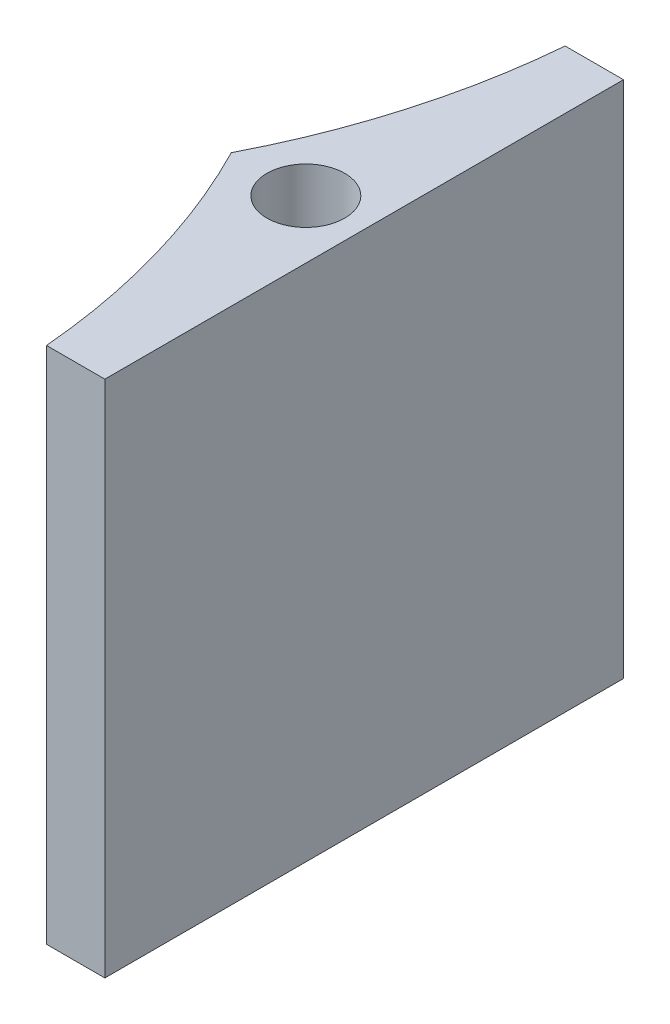
ISO-10303-21;
HEADER;
FILE_DESCRIPTION(('STEP AP214'),'2;1');
FILE_NAME('part.step','',(''),(''),'','','');
FILE_SCHEMA(('AUTOMOTIVE_DESIGN { 1 0 10303 214 1 1 1 1 }'));
ENDSEC;
DATA;
#1=APPLICATION_CONTEXT('core data for automotive mechanical design processes');
#2=APPLICATION_PROTOCOL_DEFINITION('international standard','automotive_design',2000,#1);
#3=PRODUCT_CONTEXT('',#1,'mechanical');
#4=PRODUCT('Part','Part','',(#3));
#5=PRODUCT_RELATED_PRODUCT_CATEGORY('part','',(#4));
#6=PRODUCT_DEFINITION_FORMATION('','',#4);
#7=PRODUCT_DEFINITION_CONTEXT('part definition',#1,'design');
#8=PRODUCT_DEFINITION('design','',#6,#7);
#9=PRODUCT_DEFINITION_SHAPE('','',#8);
#10=(LENGTH_UNIT() NAMED_UNIT(*) SI_UNIT(.MILLI.,.METRE.));
#11=(NAMED_UNIT(*) PLANE_ANGLE_UNIT() SI_UNIT($,.RADIAN.));
#12=(NAMED_UNIT(*) SI_UNIT($,.STERADIAN.) SOLID_ANGLE_UNIT());
#13=UNCERTAINTY_MEASURE_WITH_UNIT(LENGTH_MEASURE(1.E-05),#10,'distance_accuracy_value','');
#14=(GEOMETRIC_REPRESENTATION_CONTEXT(3) GLOBAL_UNCERTAINTY_ASSIGNED_CONTEXT((#13)) GLOBAL_UNIT_ASSIGNED_CONTEXT((#10,
#11,#12)) REPRESENTATION_CONTEXT('',''));
#15=CARTESIAN_POINT('',(0.,0.,0.));
#16=DIRECTION('',(0.,0.,1.));
#17=DIRECTION('',(1.,0.,0.));
#18=AXIS2_PLACEMENT_3D('',#15,#16,#17);
#19=CARTESIAN_POINT('',(-53.6193953968897,40.,-24.5876855313051));
#20=DIRECTION('',(0.,-1.,0.));
#21=DIRECTION('',(0.,0.,-1.));
#22=AXIS2_PLACEMENT_3D('',#19,#20,#21);
#23=PLANE('',#22);
#24=CARTESIAN_POINT('',(-53.6193953968897,40.,-24.5876855313051));
#25=DIRECTION('',(0.,-1.,0.));
#26=DIRECTION('',(0.,0.,-1.));
#27=AXIS2_PLACEMENT_3D('',#24,#25,#26);
#28=CIRCLE('',#27,53.8152991375328);
#29=CARTESIAN_POINT('',(0.,40.,-20.));
#30=VERTEX_POINT('',#29);
#31=CARTESIAN_POINT('',(-5.74944509948711,40.,0.));
#32=VERTEX_POINT('',#31);
#33=EDGE_CURVE('E117',#30,#32,#28,.T.);
#34=ORIENTED_EDGE('',*,*,#33,.T.);
#35=CARTESIAN_POINT('',(-53.6193953968897,40.,24.5876855313051));
#36=DIRECTION('',(0.,-1.,0.));
#37=DIRECTION('',(0.,0.,1.));
#38=AXIS2_PLACEMENT_3D('',#35,#36,#37);
#39=CIRCLE('',#38,53.8152991375328);
#40=CARTESIAN_POINT('',(0.,40.,20.));
#41=VERTEX_POINT('',#40);
#42=EDGE_CURVE('E84',#32,#41,#39,.T.);
#43=ORIENTED_EDGE('',*,*,#42,.T.);
#44=DIRECTION('',(1.,0.,0.));
#45=VECTOR('',#44,1.);
#46=CARTESIAN_POINT('',(0.,40.,20.));
#47=LINE('',#46,#45);
#48=CARTESIAN_POINT('',(4.5,40.,20.));
#49=VERTEX_POINT('',#48);
#50=EDGE_CURVE('E88',#41,#49,#47,.T.);
#51=ORIENTED_EDGE('',*,*,#50,.T.);
#52=DIRECTION('',(0.,0.,-1.));
#53=VECTOR('',#52,1.);
#54=CARTESIAN_POINT('',(4.49999999999998,40.,-20.));
#55=LINE('',#54,#53);
#56=CARTESIAN_POINT('',(4.49999999999998,40.,-20.));
#57=VERTEX_POINT('',#56);
#58=EDGE_CURVE('E92',#49,#57,#55,.T.);
#59=ORIENTED_EDGE('',*,*,#58,.T.);
#60=DIRECTION('',(-1.,0.,0.));
#61=VECTOR('',#60,1.);
#62=CARTESIAN_POINT('',(0.,40.,-20.));
#63=LINE('',#62,#61);
#64=EDGE_CURVE('E50',#57,#30,#63,.T.);
#65=ORIENTED_EDGE('',*,*,#64,.T.);
#66=EDGE_LOOP('',(#34,#43,#51,#59,#65));
#67=FACE_BOUND('',#66,.T.);
#68=CARTESIAN_POINT('',(0.,40.,0.));
#69=DIRECTION('',(0.,1.,0.));
#70=DIRECTION('',(0.,0.,1.));
#71=AXIS2_PLACEMENT_3D('',#68,#69,#70);
#72=CIRCLE('',#71,3.);
#73=CARTESIAN_POINT('',(0.,40.,3.));
#74=VERTEX_POINT('',#73);
#75=EDGE_CURVE('E112',#74,#74,#72,.T.);
#76=ORIENTED_EDGE('',*,*,#75,.F.);
#77=EDGE_LOOP('',(#76));
#78=FACE_BOUND('',#77,.T.);
#79=ADVANCED_FACE('F33',(#67,#78),#23,.F.);
#80=CARTESIAN_POINT('',(-53.6193953968897,0.,-24.5876855313051));
#81=DIRECTION('',(0.,-1.,0.));
#82=DIRECTION('',(0.,0.,-1.));
#83=AXIS2_PLACEMENT_3D('',#80,#81,#82);
#84=PLANE('',#83);
#85=CARTESIAN_POINT('',(-53.6193953968897,0.,-24.5876855313051));
#86=DIRECTION('',(0.,-1.,0.));
#87=DIRECTION('',(0.,0.,-1.));
#88=AXIS2_PLACEMENT_3D('',#85,#86,#87);
#89=CIRCLE('',#88,53.8152991375328);
#90=CARTESIAN_POINT('',(0.,0.,-20.));
#91=VERTEX_POINT('',#90);
#92=CARTESIAN_POINT('',(-5.74944509948711,0.,0.));
#93=VERTEX_POINT('',#92);
#94=EDGE_CURVE('E108',#91,#93,#89,.T.);
#95=ORIENTED_EDGE('',*,*,#94,.F.);
#96=DIRECTION('',(-1.,0.,0.));
#97=VECTOR('',#96,1.);
#98=CARTESIAN_POINT('',(0.,0.,-20.));
#99=LINE('',#98,#97);
#100=CARTESIAN_POINT('',(4.49999999999998,0.,-20.));
#101=VERTEX_POINT('',#100);
#102=EDGE_CURVE('E76',#101,#91,#99,.T.);
#103=ORIENTED_EDGE('',*,*,#102,.F.);
#104=DIRECTION('',(0.,0.,-1.));
#105=VECTOR('',#104,1.);
#106=CARTESIAN_POINT('',(4.49999999999998,0.,-20.));
#107=LINE('',#106,#105);
#108=CARTESIAN_POINT('',(4.5,0.,20.));
#109=VERTEX_POINT('',#108);
#110=EDGE_CURVE('E70',#109,#101,#107,.T.);
#111=ORIENTED_EDGE('',*,*,#110,.F.);
#112=DIRECTION('',(1.,0.,0.));
#113=VECTOR('',#112,1.);
#114=CARTESIAN_POINT('',(0.,0.,20.));
#115=LINE('',#114,#113);
#116=CARTESIAN_POINT('',(0.,0.,20.));
#117=VERTEX_POINT('',#116);
#118=EDGE_CURVE('E99',#117,#109,#115,.T.);
#119=ORIENTED_EDGE('',*,*,#118,.F.);
#120=CARTESIAN_POINT('',(-53.6193953968897,0.,24.5876855313051));
#121=DIRECTION('',(0.,-1.,0.));
#122=DIRECTION('',(0.,0.,1.));
#123=AXIS2_PLACEMENT_3D('',#120,#121,#122);
#124=CIRCLE('',#123,53.8152991375328);
#125=EDGE_CURVE('E111',#93,#117,#124,.T.);
#126=ORIENTED_EDGE('',*,*,#125,.F.);
#127=EDGE_LOOP('',(#95,#103,#111,#119,#126));
#128=FACE_BOUND('',#127,.T.);
#129=CARTESIAN_POINT('',(0.,0.,0.));
#130=DIRECTION('',(0.,1.,0.));
#131=DIRECTION('',(0.,0.,1.));
#132=AXIS2_PLACEMENT_3D('',#129,#130,#131);
#133=CIRCLE('',#132,3.);
#134=CARTESIAN_POINT('',(0.,0.,3.));
#135=VERTEX_POINT('',#134);
#136=EDGE_CURVE('E197',#135,#135,#133,.T.);
#137=ORIENTED_EDGE('',*,*,#136,.T.);
#138=EDGE_LOOP('',(#137));
#139=FACE_BOUND('',#138,.T.);
#140=ADVANCED_FACE('F121',(#128,#139),#84,.T.);
#141=CARTESIAN_POINT('',(-53.6193953968897,40.,-24.5876855313051));
#142=DIRECTION('',(0.,-1.,0.));
#143=DIRECTION('',(0.,0.,-1.));
#144=AXIS2_PLACEMENT_3D('',#141,#142,#143);
#145=CYLINDRICAL_SURFACE('',#144,53.8152991375328);
#146=ORIENTED_EDGE('',*,*,#94,.T.);
#147=DIRECTION('',(0.,-1.,0.));
#148=VECTOR('',#147,1.);
#149=CARTESIAN_POINT('',(-5.74944509948711,40.,0.));
#150=LINE('',#149,#148);
#151=EDGE_CURVE('E11',#32,#93,#150,.T.);
#152=ORIENTED_EDGE('',*,*,#151,.F.);
#153=ORIENTED_EDGE('',*,*,#33,.F.);
#154=DIRECTION('',(0.,-1.,0.));
#155=VECTOR('',#154,1.);
#156=CARTESIAN_POINT('',(0.,40.,-20.));
#157=LINE('',#156,#155);
#158=EDGE_CURVE('E104',#30,#91,#157,.T.);
#159=ORIENTED_EDGE('',*,*,#158,.T.);
#160=EDGE_LOOP('',(#146,#152,#153,#159));
#161=FACE_BOUND('',#160,.T.);
#162=ADVANCED_FACE('F35',(#161),#145,.F.);
#163=CARTESIAN_POINT('',(-53.6193953968897,40.,24.5876855313051));
#164=DIRECTION('',(0.,-1.,0.));
#165=DIRECTION('',(0.,0.,-1.));
#166=AXIS2_PLACEMENT_3D('',#163,#164,#165);
#167=CYLINDRICAL_SURFACE('',#166,53.8152991375328);
#168=ORIENTED_EDGE('',*,*,#125,.T.);
#169=DIRECTION('',(0.,-1.,0.));
#170=VECTOR('',#169,1.);
#171=CARTESIAN_POINT('',(0.,40.,20.));
#172=LINE('',#171,#170);
#173=EDGE_CURVE('E42',#41,#117,#172,.T.);
#174=ORIENTED_EDGE('',*,*,#173,.F.);
#175=ORIENTED_EDGE('',*,*,#42,.F.);
#176=ORIENTED_EDGE('',*,*,#151,.T.);
#177=EDGE_LOOP('',(#168,#174,#175,#176));
#178=FACE_BOUND('',#177,.T.);
#179=ADVANCED_FACE('F146',(#178),#167,.F.);
#180=CARTESIAN_POINT('',(0.,40.,20.));
#181=DIRECTION('',(0.,0.,-1.));
#182=DIRECTION('',(-1.,0.,0.));
#183=AXIS2_PLACEMENT_3D('',#180,#181,#182);
#184=PLANE('',#183);
#185=ORIENTED_EDGE('',*,*,#118,.T.);
#186=DIRECTION('',(0.,-1.,0.));
#187=VECTOR('',#186,1.);
#188=CARTESIAN_POINT('',(4.5,40.,20.));
#189=LINE('',#188,#187);
#190=EDGE_CURVE('E96',#49,#109,#189,.T.);
#191=ORIENTED_EDGE('',*,*,#190,.F.);
#192=ORIENTED_EDGE('',*,*,#50,.F.);
#193=ORIENTED_EDGE('',*,*,#173,.T.);
#194=EDGE_LOOP('',(#185,#191,#192,#193));
#195=FACE_BOUND('',#194,.T.);
#196=ADVANCED_FACE('F97',(#195),#184,.F.);
#197=CARTESIAN_POINT('',(4.49999999999998,40.,-20.));
#198=DIRECTION('',(-1.,0.,0.));
#199=DIRECTION('',(0.,0.,1.));
#200=AXIS2_PLACEMENT_3D('',#197,#198,#199);
#201=PLANE('',#200);
#202=ORIENTED_EDGE('',*,*,#110,.T.);
#203=DIRECTION('',(0.,-1.,0.));
#204=VECTOR('',#203,1.);
#205=CARTESIAN_POINT('',(4.49999999999998,40.,-20.));
#206=LINE('',#205,#204);
#207=EDGE_CURVE('E100',#57,#101,#206,.T.);
#208=ORIENTED_EDGE('',*,*,#207,.F.);
#209=ORIENTED_EDGE('',*,*,#58,.F.);
#210=ORIENTED_EDGE('',*,*,#190,.T.);
#211=EDGE_LOOP('',(#202,#208,#209,#210));
#212=FACE_BOUND('',#211,.T.);
#213=ADVANCED_FACE('F102',(#212),#201,.F.);
#214=CARTESIAN_POINT('',(0.,40.,-20.));
#215=DIRECTION('',(0.,0.,1.));
#216=DIRECTION('',(1.,0.,0.));
#217=AXIS2_PLACEMENT_3D('',#214,#215,#216);
#218=PLANE('',#217);
#219=ORIENTED_EDGE('',*,*,#102,.T.);
#220=ORIENTED_EDGE('',*,*,#158,.F.);
#221=ORIENTED_EDGE('',*,*,#64,.F.);
#222=ORIENTED_EDGE('',*,*,#207,.T.);
#223=EDGE_LOOP('',(#219,#220,#221,#222));
#224=FACE_BOUND('',#223,.T.);
#225=ADVANCED_FACE('F126',(#224),#218,.F.);
#226=CARTESIAN_POINT('',(0.,40.,0.));
#227=DIRECTION('',(0.,-1.,0.));
#228=DIRECTION('',(0.,0.,-1.));
#229=AXIS2_PLACEMENT_3D('',#226,#227,#228);
#230=CYLINDRICAL_SURFACE('',#229,3.);
#231=ORIENTED_EDGE('',*,*,#75,.T.);
#232=EDGE_LOOP('',(#231));
#233=FACE_BOUND('',#232,.T.);
#234=ORIENTED_EDGE('',*,*,#136,.F.);
#235=EDGE_LOOP('',(#234));
#236=FACE_BOUND('',#235,.T.);
#237=ADVANCED_FACE('F128',(#233,#236),#230,.F.);
#238=CLOSED_SHELL('',(#79,#140,#162,#179,#196,#213,#225,#237));
#239=MANIFOLD_SOLID_BREP('B2',#238);
#240=ADVANCED_BREP_SHAPE_REPRESENTATION('',(#18,#239),#14);
#241=SHAPE_DEFINITION_REPRESENTATION(#9,#240);
ENDSEC;
END-ISO-10303-21;
